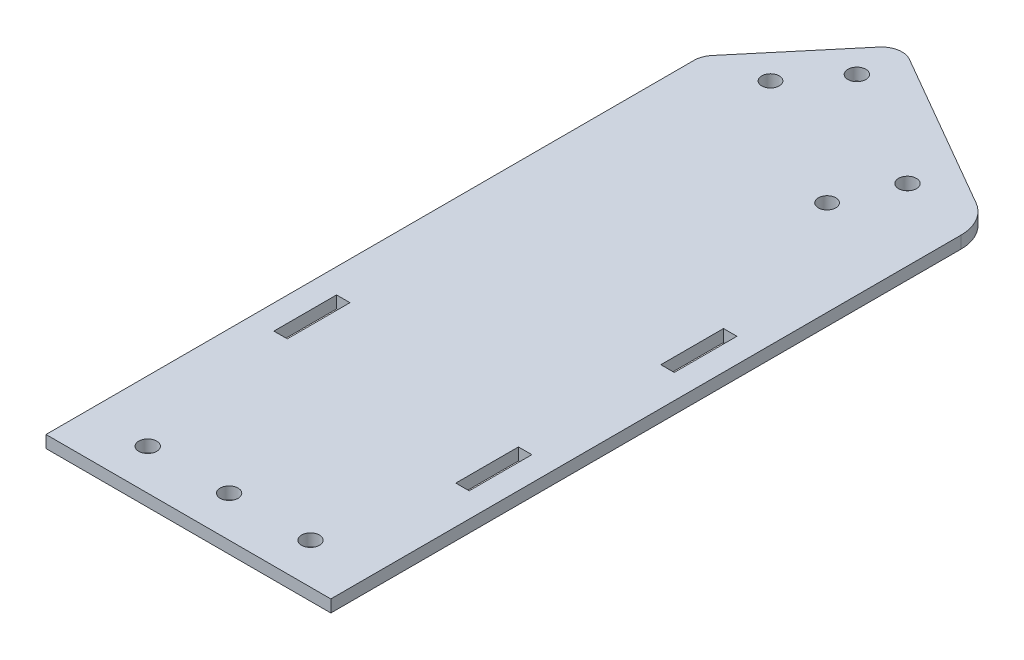
ISO-10303-21;
HEADER;
FILE_DESCRIPTION(('STEP AP214'),'2;1');
FILE_NAME('part.step','',(''),(''),'','','');
FILE_SCHEMA(('AUTOMOTIVE_DESIGN { 1 0 10303 214 1 1 1 1 }'));
ENDSEC;
DATA;
#1=APPLICATION_CONTEXT('core data for automotive mechanical design processes');
#2=APPLICATION_PROTOCOL_DEFINITION('international standard','automotive_design',2000,#1);
#3=PRODUCT_CONTEXT('',#1,'mechanical');
#4=PRODUCT('Part','Part','',(#3));
#5=PRODUCT_RELATED_PRODUCT_CATEGORY('part','',(#4));
#6=PRODUCT_DEFINITION_FORMATION('','',#4);
#7=PRODUCT_DEFINITION_CONTEXT('part definition',#1,'design');
#8=PRODUCT_DEFINITION('design','',#6,#7);
#9=PRODUCT_DEFINITION_SHAPE('','',#8);
#10=(LENGTH_UNIT() NAMED_UNIT(*) SI_UNIT(.MILLI.,.METRE.));
#11=(NAMED_UNIT(*) PLANE_ANGLE_UNIT() SI_UNIT($,.RADIAN.));
#12=(NAMED_UNIT(*) SI_UNIT($,.STERADIAN.) SOLID_ANGLE_UNIT());
#13=UNCERTAINTY_MEASURE_WITH_UNIT(LENGTH_MEASURE(1.E-05),#10,'distance_accuracy_value','');
#14=(GEOMETRIC_REPRESENTATION_CONTEXT(3) GLOBAL_UNCERTAINTY_ASSIGNED_CONTEXT((#13)) GLOBAL_UNIT_ASSIGNED_CONTEXT((#10,
#11,#12)) REPRESENTATION_CONTEXT('',''));
#15=CARTESIAN_POINT('',(0.,0.,0.));
#16=DIRECTION('',(0.,0.,1.));
#17=DIRECTION('',(1.,0.,0.));
#18=AXIS2_PLACEMENT_3D('',#15,#16,#17);
#19=CARTESIAN_POINT('',(35.,1.5,0.));
#20=DIRECTION('',(1.,0.,0.));
#21=DIRECTION('',(0.,0.,-1.));
#22=AXIS2_PLACEMENT_3D('',#19,#20,#21);
#23=PLANE('',#22);
#24=DIRECTION('',(0.,0.,1.));
#25=VECTOR('',#24,1.);
#26=CARTESIAN_POINT('',(35.,-1.5,0.));
#27=LINE('',#26,#25);
#28=CARTESIAN_POINT('',(35.,-1.5,-74.5664973081037));
#29=VERTEX_POINT('',#28);
#30=CARTESIAN_POINT('',(35.,-1.5,80.34));
#31=VERTEX_POINT('',#30);
#32=EDGE_CURVE('E317',#29,#31,#27,.T.);
#33=ORIENTED_EDGE('',*,*,#32,.F.);
#34=DIRECTION('',(0.,-1.,0.));
#35=VECTOR('',#34,1.);
#36=CARTESIAN_POINT('',(35.,1.5,-74.5664973081037));
#37=LINE('',#36,#35);
#38=CARTESIAN_POINT('',(35.,1.5,-74.5664973081037));
#39=VERTEX_POINT('',#38);
#40=EDGE_CURVE('E348',#29,#39,#37,.F.);
#41=ORIENTED_EDGE('',*,*,#40,.T.);
#42=DIRECTION('',(0.,0.,1.));
#43=VECTOR('',#42,1.);
#44=CARTESIAN_POINT('',(35.,1.5,0.));
#45=LINE('',#44,#43);
#46=CARTESIAN_POINT('',(35.,1.5,80.34));
#47=VERTEX_POINT('',#46);
#48=EDGE_CURVE('E318',#39,#47,#45,.T.);
#49=ORIENTED_EDGE('',*,*,#48,.T.);
#50=DIRECTION('',(0.,-1.,0.));
#51=VECTOR('',#50,1.);
#52=CARTESIAN_POINT('',(35.,1.5,80.34));
#53=LINE('',#52,#51);
#54=EDGE_CURVE('E329',#47,#31,#53,.T.);
#55=ORIENTED_EDGE('',*,*,#54,.T.);
#56=EDGE_LOOP('',(#33,#41,#49,#55));
#57=FACE_BOUND('',#56,.T.);
#58=ADVANCED_FACE('F44',(#57),#23,.T.);
#59=CARTESIAN_POINT('',(43.5382404700205,1.5,-75.410444566228));
#60=DIRECTION('',(-0.499999999999995,0.,0.866025403784441));
#61=DIRECTION('',(0.866025403784442,0.,0.499999999999995));
#62=AXIS2_PLACEMENT_3D('',#59,#60,#61);
#63=PLANE('',#62);
#64=DIRECTION('',(-0.866025403784442,0.,-0.499999999999995));
#65=VECTOR('',#64,1.);
#66=CARTESIAN_POINT('',(43.5382404700205,-1.5,-75.410444566228));
#67=LINE('',#66,#65);
#68=CARTESIAN_POINT('',(29.9999999999999,-1.5,-83.2267513459481));
#69=VERTEX_POINT('',#68);
#70=CARTESIAN_POINT('',(-8.75627451852881,-1.5,-105.602696872007));
#71=VERTEX_POINT('',#70);
#72=EDGE_CURVE('E331',#69,#71,#67,.T.);
#73=ORIENTED_EDGE('',*,*,#72,.T.);
#74=DIRECTION('',(0.,-1.,0.));
#75=VECTOR('',#74,1.);
#76=CARTESIAN_POINT('',(-8.75627451852879,1.5,-105.602696872007));
#77=LINE('',#76,#75);
#78=CARTESIAN_POINT('',(-8.75627451852881,1.5,-105.602696872007));
#79=VERTEX_POINT('',#78);
#80=EDGE_CURVE('E11',#71,#79,#77,.F.);
#81=ORIENTED_EDGE('',*,*,#80,.T.);
#82=DIRECTION('',(-0.866025403784442,0.,-0.499999999999995));
#83=VECTOR('',#82,1.);
#84=CARTESIAN_POINT('',(43.5382404700205,1.5,-75.410444566228));
#85=LINE('',#84,#83);
#86=CARTESIAN_POINT('',(29.9999999999999,1.5,-83.2267513459481));
#87=VERTEX_POINT('',#86);
#88=EDGE_CURVE('E320',#87,#79,#85,.T.);
#89=ORIENTED_EDGE('',*,*,#88,.F.);
#90=DIRECTION('',(0.,-1.,0.));
#91=VECTOR('',#90,1.);
#92=CARTESIAN_POINT('',(29.9999999999999,-1.5,-83.2267513459481));
#93=LINE('',#92,#91);
#94=EDGE_CURVE('E343',#87,#69,#93,.T.);
#95=ORIENTED_EDGE('',*,*,#94,.T.);
#96=EDGE_LOOP('',(#73,#81,#89,#95));
#97=FACE_BOUND('',#96,.T.);
#98=ADVANCED_FACE('F442',(#97),#63,.F.);
#99=CARTESIAN_POINT('',(-35.,1.5,0.));
#100=DIRECTION('',(1.,0.,0.));
#101=DIRECTION('',(0.,0.,-1.));
#102=AXIS2_PLACEMENT_3D('',#99,#100,#101);
#103=PLANE('',#102);
#104=DIRECTION('',(0.,0.,1.));
#105=VECTOR('',#104,1.);
#106=CARTESIAN_POINT('',(-35.,1.5,0.));
#107=LINE('',#106,#105);
#108=CARTESIAN_POINT('',(-35.,1.5,-78.9346676719422));
#109=VERTEX_POINT('',#108);
#110=CARTESIAN_POINT('',(-35.,1.5,80.34));
#111=VERTEX_POINT('',#110);
#112=EDGE_CURVE('E324',#109,#111,#107,.T.);
#113=ORIENTED_EDGE('',*,*,#112,.F.);
#114=DIRECTION('',(0.,1.,0.));
#115=VECTOR('',#114,1.);
#116=CARTESIAN_POINT('',(-35.,-1.5,-78.9346676719422));
#117=LINE('',#116,#115);
#118=CARTESIAN_POINT('',(-35.,-1.5,-78.9346676719422));
#119=VERTEX_POINT('',#118);
#120=EDGE_CURVE('E358',#109,#119,#117,.F.);
#121=ORIENTED_EDGE('',*,*,#120,.T.);
#122=DIRECTION('',(0.,0.,1.));
#123=VECTOR('',#122,1.);
#124=CARTESIAN_POINT('',(-35.,-1.5,0.));
#125=LINE('',#124,#123);
#126=CARTESIAN_POINT('',(-35.,-1.5,80.34));
#127=VERTEX_POINT('',#126);
#128=EDGE_CURVE('E334',#119,#127,#125,.T.);
#129=ORIENTED_EDGE('',*,*,#128,.T.);
#130=DIRECTION('',(0.,-1.,0.));
#131=VECTOR('',#130,1.);
#132=CARTESIAN_POINT('',(-35.,1.5,80.34));
#133=LINE('',#132,#131);
#134=EDGE_CURVE('E340',#111,#127,#133,.T.);
#135=ORIENTED_EDGE('',*,*,#134,.F.);
#136=EDGE_LOOP('',(#113,#121,#129,#135));
#137=FACE_BOUND('',#136,.T.);
#138=ADVANCED_FACE('F423',(#137),#103,.F.);
#139=CARTESIAN_POINT('',(0.,1.5,80.34));
#140=DIRECTION('',(0.,0.,-1.));
#141=DIRECTION('',(-1.,0.,0.));
#142=AXIS2_PLACEMENT_3D('',#139,#140,#141);
#143=PLANE('',#142);
#144=DIRECTION('',(1.,0.,0.));
#145=VECTOR('',#144,1.);
#146=CARTESIAN_POINT('',(0.,-1.5,80.34));
#147=LINE('',#146,#145);
#148=EDGE_CURVE('E321',#127,#31,#147,.T.);
#149=ORIENTED_EDGE('',*,*,#148,.T.);
#150=ORIENTED_EDGE('',*,*,#54,.F.);
#151=DIRECTION('',(1.,0.,0.));
#152=VECTOR('',#151,1.);
#153=CARTESIAN_POINT('',(0.,1.5,80.34));
#154=LINE('',#153,#152);
#155=EDGE_CURVE('E326',#111,#47,#154,.T.);
#156=ORIENTED_EDGE('',*,*,#155,.F.);
#157=ORIENTED_EDGE('',*,*,#134,.T.);
#158=EDGE_LOOP('',(#149,#150,#156,#157));
#159=FACE_BOUND('',#158,.T.);
#160=ADVANCED_FACE('F389',(#159),#143,.F.);
#161=CARTESIAN_POINT('',(0.,1.5,0.));
#162=DIRECTION('',(0.,1.,0.));
#163=DIRECTION('',(0.,0.,1.));
#164=AXIS2_PLACEMENT_3D('',#161,#162,#163);
#165=PLANE('',#164);
#166=CARTESIAN_POINT('',(-21.2320508075689,1.5,-83.9380762113534));
#167=DIRECTION('',(0.,1.,0.));
#168=DIRECTION('',(0.,0.,1.));
#169=AXIS2_PLACEMENT_3D('',#166,#167,#168);
#170=CIRCLE('',#169,2.15);
#171=CARTESIAN_POINT('',(-21.2320508075689,1.5,-81.7880762113534));
#172=VERTEX_POINT('',#171);
#173=EDGE_CURVE('E373',#172,#172,#170,.T.);
#174=ORIENTED_EDGE('',*,*,#173,.F.);
#175=EDGE_LOOP('',(#174));
#176=FACE_BOUND('',#175,.T.);
#177=CARTESIAN_POINT('',(11.6769145362398,1.5,-64.9380762113534));
#178=DIRECTION('',(0.,1.,0.));
#179=DIRECTION('',(0.,0.,1.));
#180=AXIS2_PLACEMENT_3D('',#177,#178,#179);
#181=CIRCLE('',#180,2.14999999999999);
#182=CARTESIAN_POINT('',(11.6769145362398,1.5,-62.7880762113534));
#183=VERTEX_POINT('',#182);
#184=EDGE_CURVE('E211',#183,#183,#181,.T.);
#185=ORIENTED_EDGE('',*,*,#184,.F.);
#186=EDGE_LOOP('',(#185));
#187=FACE_BOUND('',#186,.T.);
#188=DIRECTION('',(0.,0.,1.));
#189=VECTOR('',#188,1.);
#190=CARTESIAN_POINT('',(-29.,1.5,0.));
#191=LINE('',#190,#189);
#192=CARTESIAN_POINT('',(-29.,1.5,14.94));
#193=VERTEX_POINT('',#192);
#194=CARTESIAN_POINT('',(-29.,1.5,30.34));
#195=VERTEX_POINT('',#194);
#196=EDGE_CURVE('E188',#193,#195,#191,.T.);
#197=ORIENTED_EDGE('',*,*,#196,.F.);
#198=DIRECTION('',(-1.,0.,0.));
#199=VECTOR('',#198,1.);
#200=CARTESIAN_POINT('',(0.,1.5,14.94));
#201=LINE('',#200,#199);
#202=CARTESIAN_POINT('',(-25.7,1.5,14.94));
#203=VERTEX_POINT('',#202);
#204=EDGE_CURVE('E284',#203,#193,#201,.T.);
#205=ORIENTED_EDGE('',*,*,#204,.F.);
#206=DIRECTION('',(0.,0.,-1.));
#207=VECTOR('',#206,1.);
#208=CARTESIAN_POINT('',(-25.7,1.5,0.));
#209=LINE('',#208,#207);
#210=CARTESIAN_POINT('',(-25.7,1.5,30.34));
#211=VERTEX_POINT('',#210);
#212=EDGE_CURVE('E282',#211,#203,#209,.T.);
#213=ORIENTED_EDGE('',*,*,#212,.F.);
#214=DIRECTION('',(1.,0.,0.));
#215=VECTOR('',#214,1.);
#216=CARTESIAN_POINT('',(0.,1.5,30.34));
#217=LINE('',#216,#215);
#218=EDGE_CURVE('E280',#195,#211,#217,.T.);
#219=ORIENTED_EDGE('',*,*,#218,.F.);
#220=EDGE_LOOP('',(#197,#205,#213,#219));
#221=FACE_BOUND('',#220,.T.);
#222=DIRECTION('',(0.,0.,1.));
#223=VECTOR('',#222,1.);
#224=CARTESIAN_POINT('',(25.7,1.5,0.));
#225=LINE('',#224,#223);
#226=CARTESIAN_POINT('',(25.7,1.5,24.94));
#227=VERTEX_POINT('',#226);
#228=CARTESIAN_POINT('',(25.7,1.5,40.34));
#229=VERTEX_POINT('',#228);
#230=EDGE_CURVE('E278',#227,#229,#225,.T.);
#231=ORIENTED_EDGE('',*,*,#230,.F.);
#232=DIRECTION('',(-1.,0.,0.));
#233=VECTOR('',#232,1.);
#234=CARTESIAN_POINT('',(0.,1.5,24.94));
#235=LINE('',#234,#233);
#236=CARTESIAN_POINT('',(29.,1.5,24.94));
#237=VERTEX_POINT('',#236);
#238=EDGE_CURVE('E276',#237,#227,#235,.T.);
#239=ORIENTED_EDGE('',*,*,#238,.F.);
#240=DIRECTION('',(0.,0.,-1.));
#241=VECTOR('',#240,1.);
#242=CARTESIAN_POINT('',(29.,1.5,0.));
#243=LINE('',#242,#241);
#244=CARTESIAN_POINT('',(29.,1.5,40.34));
#245=VERTEX_POINT('',#244);
#246=EDGE_CURVE('E274',#245,#237,#243,.T.);
#247=ORIENTED_EDGE('',*,*,#246,.F.);
#248=DIRECTION('',(1.,0.,0.));
#249=VECTOR('',#248,1.);
#250=CARTESIAN_POINT('',(0.,1.5,40.34));
#251=LINE('',#250,#249);
#252=EDGE_CURVE('E272',#229,#245,#251,.T.);
#253=ORIENTED_EDGE('',*,*,#252,.F.);
#254=EDGE_LOOP('',(#231,#239,#247,#253));
#255=FACE_BOUND('',#254,.T.);
#256=DIRECTION('',(-1.,0.,0.));
#257=VECTOR('',#256,1.);
#258=CARTESIAN_POINT('',(0.,1.5,-25.46));
#259=LINE('',#258,#257);
#260=CARTESIAN_POINT('',(29.,1.5,-25.46));
#261=VERTEX_POINT('',#260);
#262=CARTESIAN_POINT('',(25.7,1.5,-25.46));
#263=VERTEX_POINT('',#262);
#264=EDGE_CURVE('E269',#261,#263,#259,.T.);
#265=ORIENTED_EDGE('',*,*,#264,.F.);
#266=DIRECTION('',(0.,0.,-1.));
#267=VECTOR('',#266,1.);
#268=CARTESIAN_POINT('',(29.,1.5,0.));
#269=LINE('',#268,#267);
#270=CARTESIAN_POINT('',(29.,1.5,-10.06));
#271=VERTEX_POINT('',#270);
#272=EDGE_CURVE('E267',#271,#261,#269,.T.);
#273=ORIENTED_EDGE('',*,*,#272,.F.);
#274=DIRECTION('',(1.,0.,0.));
#275=VECTOR('',#274,1.);
#276=CARTESIAN_POINT('',(0.,1.5,-10.06));
#277=LINE('',#276,#275);
#278=CARTESIAN_POINT('',(25.7,1.5,-10.06));
#279=VERTEX_POINT('',#278);
#280=EDGE_CURVE('E265',#279,#271,#277,.T.);
#281=ORIENTED_EDGE('',*,*,#280,.F.);
#282=DIRECTION('',(0.,0.,1.));
#283=VECTOR('',#282,1.);
#284=CARTESIAN_POINT('',(25.7,1.5,0.));
#285=LINE('',#284,#283);
#286=EDGE_CURVE('E218',#263,#279,#285,.T.);
#287=ORIENTED_EDGE('',*,*,#286,.F.);
#288=EDGE_LOOP('',(#265,#273,#281,#287));
#289=FACE_BOUND('',#288,.T.);
#290=CARTESIAN_POINT('',(20.,1.5,70.34));
#291=DIRECTION('',(0.,1.,0.));
#292=DIRECTION('',(0.,0.,1.));
#293=AXIS2_PLACEMENT_3D('',#290,#291,#292);
#294=CIRCLE('',#293,2.2);
#295=CARTESIAN_POINT('',(20.,1.5,72.54));
#296=VERTEX_POINT('',#295);
#297=EDGE_CURVE('E302',#296,#296,#294,.T.);
#298=ORIENTED_EDGE('',*,*,#297,.F.);
#299=EDGE_LOOP('',(#298));
#300=FACE_BOUND('',#299,.T.);
#301=CARTESIAN_POINT('',(-20.,1.5,70.34));
#302=DIRECTION('',(0.,1.,0.));
#303=DIRECTION('',(0.,0.,1.));
#304=AXIS2_PLACEMENT_3D('',#301,#302,#303);
#305=CIRCLE('',#304,2.2);
#306=CARTESIAN_POINT('',(-20.,1.5,72.54));
#307=VERTEX_POINT('',#306);
#308=EDGE_CURVE('E299',#307,#307,#305,.T.);
#309=ORIENTED_EDGE('',*,*,#308,.F.);
#310=EDGE_LOOP('',(#309));
#311=FACE_BOUND('',#310,.T.);
#312=CARTESIAN_POINT('',(0.,1.5,70.34));
#313=DIRECTION('',(0.,1.,0.));
#314=DIRECTION('',(0.,0.,1.));
#315=AXIS2_PLACEMENT_3D('',#312,#313,#314);
#316=CIRCLE('',#315,2.2);
#317=CARTESIAN_POINT('',(0.,1.5,72.54));
#318=VERTEX_POINT('',#317);
#319=EDGE_CURVE('E296',#318,#318,#316,.T.);
#320=ORIENTED_EDGE('',*,*,#319,.F.);
#321=EDGE_LOOP('',(#320));
#322=FACE_BOUND('',#321,.T.);
#323=CARTESIAN_POINT('',(-12.,1.5,-95.9284572681199));
#324=DIRECTION('',(0.,1.,0.));
#325=DIRECTION('',(0.,0.,1.));
#326=AXIS2_PLACEMENT_3D('',#323,#324,#325);
#327=CIRCLE('',#326,2.19999999999999);
#328=CARTESIAN_POINT('',(-12.,1.5,-93.7284572681199));
#329=VERTEX_POINT('',#328);
#330=EDGE_CURVE('E314',#329,#329,#327,.T.);
#331=ORIENTED_EDGE('',*,*,#330,.F.);
#332=EDGE_LOOP('',(#331));
#333=FACE_BOUND('',#332,.T.);
#334=CARTESIAN_POINT('',(17.4448637286709,1.5,-78.92845726812));
#335=DIRECTION('',(0.,1.,0.));
#336=DIRECTION('',(0.,0.,1.));
#337=AXIS2_PLACEMENT_3D('',#334,#335,#336);
#338=CIRCLE('',#337,2.20000000000001);
#339=CARTESIAN_POINT('',(17.4448637286709,1.5,-76.7284572681199));
#340=VERTEX_POINT('',#339);
#341=EDGE_CURVE('E309',#340,#340,#338,.T.);
#342=ORIENTED_EDGE('',*,*,#341,.F.);
#343=EDGE_LOOP('',(#342));
#344=FACE_BOUND('',#343,.T.);
#345=DIRECTION('',(0.642787609686539,0.,-0.766044443118979));
#346=VECTOR('',#345,1.);
#347=CARTESIAN_POINT('',(-60.3026812329843,1.5,-50.5999575815981));
#348=LINE('',#347,#346);
#349=CARTESIAN_POINT('',(-15.0864967341237,1.5,-104.486507901518));
#350=VERTEX_POINT('',#349);
#351=CARTESIAN_POINT('',(-33.8302222155949,1.5,-82.1486057203749));
#352=VERTEX_POINT('',#351);
#353=EDGE_CURVE('E355',#350,#352,#348,.F.);
#354=ORIENTED_EDGE('',*,*,#353,.T.);
#355=CARTESIAN_POINT('',(-30.,1.5,-78.9346676719422));
#356=DIRECTION('',(0.,1.,0.));
#357=DIRECTION('',(0.,0.,1.));
#358=AXIS2_PLACEMENT_3D('',#355,#356,#357);
#359=CIRCLE('',#358,5.);
#360=EDGE_CURVE('E53',#352,#109,#359,.T.);
#361=ORIENTED_EDGE('',*,*,#360,.T.);
#362=ORIENTED_EDGE('',*,*,#112,.T.);
#363=ORIENTED_EDGE('',*,*,#155,.T.);
#364=ORIENTED_EDGE('',*,*,#48,.F.);
#365=CARTESIAN_POINT('',(25.,1.5,-74.5664973081037));
#366=DIRECTION('',(0.,1.,0.));
#367=DIRECTION('',(0.,0.,1.));
#368=AXIS2_PLACEMENT_3D('',#365,#366,#367);
#369=CIRCLE('',#368,10.);
#370=EDGE_CURVE('E350',#39,#87,#369,.T.);
#371=ORIENTED_EDGE('',*,*,#370,.T.);
#372=ORIENTED_EDGE('',*,*,#88,.T.);
#373=CARTESIAN_POINT('',(-11.2562745185288,1.5,-101.272569853085));
#374=DIRECTION('',(0.,1.,0.));
#375=DIRECTION('',(0.,0.,1.));
#376=AXIS2_PLACEMENT_3D('',#373,#374,#375);
#377=CIRCLE('',#376,5.);
#378=EDGE_CURVE('E369',#79,#350,#377,.T.);
#379=ORIENTED_EDGE('',*,*,#378,.T.);
#380=EDGE_LOOP('',(#354,#361,#362,#363,#364,#371,#372,#379));
#381=FACE_BOUND('',#380,.T.);
#382=ADVANCED_FACE('F386',(#176,#187,#221,#255,#289,#300,#311,#322,#333,#344,#381),#165,.T.);
#383=CARTESIAN_POINT('',(0.,-1.5,0.));
#384=DIRECTION('',(0.,1.,0.));
#385=DIRECTION('',(0.,0.,1.));
#386=AXIS2_PLACEMENT_3D('',#383,#384,#385);
#387=PLANE('',#386);
#388=CARTESIAN_POINT('',(-21.2320508075689,-1.5,-83.9380762113534));
#389=DIRECTION('',(0.,1.,0.));
#390=DIRECTION('',(0.,0.,1.));
#391=AXIS2_PLACEMENT_3D('',#388,#389,#390);
#392=CIRCLE('',#391,2.15);
#393=CARTESIAN_POINT('',(-21.2320508075689,-1.5,-81.7880762113534));
#394=VERTEX_POINT('',#393);
#395=EDGE_CURVE('E48',#394,#394,#392,.T.);
#396=ORIENTED_EDGE('',*,*,#395,.T.);
#397=EDGE_LOOP('',(#396));
#398=FACE_BOUND('',#397,.T.);
#399=CARTESIAN_POINT('',(11.6769145362398,-1.5,-64.9380762113534));
#400=DIRECTION('',(0.,1.,0.));
#401=DIRECTION('',(0.,0.,1.));
#402=AXIS2_PLACEMENT_3D('',#399,#400,#401);
#403=CIRCLE('',#402,2.14999999999999);
#404=CARTESIAN_POINT('',(11.6769145362398,-1.5,-62.7880762113534));
#405=VERTEX_POINT('',#404);
#406=EDGE_CURVE('E371',#405,#405,#403,.T.);
#407=ORIENTED_EDGE('',*,*,#406,.T.);
#408=EDGE_LOOP('',(#407));
#409=FACE_BOUND('',#408,.T.);
#410=DIRECTION('',(-1.,0.,0.));
#411=VECTOR('',#410,1.);
#412=CARTESIAN_POINT('',(-29.,-1.5,14.94));
#413=LINE('',#412,#411);
#414=CARTESIAN_POINT('',(-25.7,-1.5,14.94));
#415=VERTEX_POINT('',#414);
#416=CARTESIAN_POINT('',(-29.,-1.5,14.94));
#417=VERTEX_POINT('',#416);
#418=EDGE_CURVE('E191',#415,#417,#413,.T.);
#419=ORIENTED_EDGE('',*,*,#418,.T.);
#420=DIRECTION('',(0.,0.,1.));
#421=VECTOR('',#420,1.);
#422=CARTESIAN_POINT('',(-29.,-1.5,14.94));
#423=LINE('',#422,#421);
#424=CARTESIAN_POINT('',(-29.,-1.5,30.34));
#425=VERTEX_POINT('',#424);
#426=EDGE_CURVE('E185',#417,#425,#423,.T.);
#427=ORIENTED_EDGE('',*,*,#426,.T.);
#428=DIRECTION('',(1.,0.,0.));
#429=VECTOR('',#428,1.);
#430=CARTESIAN_POINT('',(-29.,-1.5,30.34));
#431=LINE('',#430,#429);
#432=CARTESIAN_POINT('',(-25.7,-1.5,30.34));
#433=VERTEX_POINT('',#432);
#434=EDGE_CURVE('E195',#425,#433,#431,.T.);
#435=ORIENTED_EDGE('',*,*,#434,.T.);
#436=DIRECTION('',(0.,0.,-1.));
#437=VECTOR('',#436,1.);
#438=CARTESIAN_POINT('',(-25.7,-1.5,14.94));
#439=LINE('',#438,#437);
#440=EDGE_CURVE('E200',#433,#415,#439,.T.);
#441=ORIENTED_EDGE('',*,*,#440,.T.);
#442=EDGE_LOOP('',(#419,#427,#435,#441));
#443=FACE_BOUND('',#442,.T.);
#444=DIRECTION('',(-1.,0.,0.));
#445=VECTOR('',#444,1.);
#446=CARTESIAN_POINT('',(25.7,-1.5,24.94));
#447=LINE('',#446,#445);
#448=CARTESIAN_POINT('',(29.,-1.5,24.94));
#449=VERTEX_POINT('',#448);
#450=CARTESIAN_POINT('',(25.7,-1.5,24.94));
#451=VERTEX_POINT('',#450);
#452=EDGE_CURVE('E224',#449,#451,#447,.T.);
#453=ORIENTED_EDGE('',*,*,#452,.T.);
#454=DIRECTION('',(0.,0.,1.));
#455=VECTOR('',#454,1.);
#456=CARTESIAN_POINT('',(25.7,-1.5,24.94));
#457=LINE('',#456,#455);
#458=CARTESIAN_POINT('',(25.7,-1.5,40.34));
#459=VERTEX_POINT('',#458);
#460=EDGE_CURVE('E205',#451,#459,#457,.T.);
#461=ORIENTED_EDGE('',*,*,#460,.T.);
#462=DIRECTION('',(1.,0.,0.));
#463=VECTOR('',#462,1.);
#464=CARTESIAN_POINT('',(25.7,-1.5,40.34));
#465=LINE('',#464,#463);
#466=CARTESIAN_POINT('',(29.,-1.5,40.34));
#467=VERTEX_POINT('',#466);
#468=EDGE_CURVE('E208',#459,#467,#465,.T.);
#469=ORIENTED_EDGE('',*,*,#468,.T.);
#470=DIRECTION('',(0.,0.,-1.));
#471=VECTOR('',#470,1.);
#472=CARTESIAN_POINT('',(29.,-1.5,24.94));
#473=LINE('',#472,#471);
#474=EDGE_CURVE('E237',#467,#449,#473,.T.);
#475=ORIENTED_EDGE('',*,*,#474,.T.);
#476=EDGE_LOOP('',(#453,#461,#469,#475));
#477=FACE_BOUND('',#476,.T.);
#478=DIRECTION('',(0.,0.,-1.));
#479=VECTOR('',#478,1.);
#480=CARTESIAN_POINT('',(29.,-1.5,-25.46));
#481=LINE('',#480,#479);
#482=CARTESIAN_POINT('',(29.,-1.5,-10.06));
#483=VERTEX_POINT('',#482);
#484=CARTESIAN_POINT('',(29.,-1.5,-25.46));
#485=VERTEX_POINT('',#484);
#486=EDGE_CURVE('E244',#483,#485,#481,.T.);
#487=ORIENTED_EDGE('',*,*,#486,.T.);
#488=DIRECTION('',(-1.,0.,0.));
#489=VECTOR('',#488,1.);
#490=CARTESIAN_POINT('',(25.7,-1.5,-25.46));
#491=LINE('',#490,#489);
#492=CARTESIAN_POINT('',(25.7,-1.5,-25.46));
#493=VERTEX_POINT('',#492);
#494=EDGE_CURVE('E234',#485,#493,#491,.T.);
#495=ORIENTED_EDGE('',*,*,#494,.T.);
#496=DIRECTION('',(0.,0.,1.));
#497=VECTOR('',#496,1.);
#498=CARTESIAN_POINT('',(25.7,-1.5,-25.46));
#499=LINE('',#498,#497);
#500=CARTESIAN_POINT('',(25.7,-1.5,-10.06));
#501=VERTEX_POINT('',#500);
#502=EDGE_CURVE('E259',#493,#501,#499,.T.);
#503=ORIENTED_EDGE('',*,*,#502,.T.);
#504=DIRECTION('',(1.,0.,0.));
#505=VECTOR('',#504,1.);
#506=CARTESIAN_POINT('',(25.7,-1.5,-10.06));
#507=LINE('',#506,#505);
#508=EDGE_CURVE('E256',#501,#483,#507,.T.);
#509=ORIENTED_EDGE('',*,*,#508,.T.);
#510=EDGE_LOOP('',(#487,#495,#503,#509));
#511=FACE_BOUND('',#510,.T.);
#512=CARTESIAN_POINT('',(20.,-1.5,70.34));
#513=DIRECTION('',(0.,1.,0.));
#514=DIRECTION('',(0.,0.,1.));
#515=AXIS2_PLACEMENT_3D('',#512,#513,#514);
#516=CIRCLE('',#515,2.2);
#517=CARTESIAN_POINT('',(20.,-1.5,72.54));
#518=VERTEX_POINT('',#517);
#519=EDGE_CURVE('E287',#518,#518,#516,.T.);
#520=ORIENTED_EDGE('',*,*,#519,.T.);
#521=EDGE_LOOP('',(#520));
#522=FACE_BOUND('',#521,.T.);
#523=CARTESIAN_POINT('',(-20.,-1.5,70.34));
#524=DIRECTION('',(0.,1.,0.));
#525=DIRECTION('',(0.,0.,1.));
#526=AXIS2_PLACEMENT_3D('',#523,#524,#525);
#527=CIRCLE('',#526,2.2);
#528=CARTESIAN_POINT('',(-20.,-1.5,72.54));
#529=VERTEX_POINT('',#528);
#530=EDGE_CURVE('E288',#529,#529,#527,.T.);
#531=ORIENTED_EDGE('',*,*,#530,.T.);
#532=EDGE_LOOP('',(#531));
#533=FACE_BOUND('',#532,.T.);
#534=CARTESIAN_POINT('',(0.,-1.5,70.34));
#535=DIRECTION('',(0.,1.,0.));
#536=DIRECTION('',(0.,0.,1.));
#537=AXIS2_PLACEMENT_3D('',#534,#535,#536);
#538=CIRCLE('',#537,2.2);
#539=CARTESIAN_POINT('',(0.,-1.5,72.54));
#540=VERTEX_POINT('',#539);
#541=EDGE_CURVE('E291',#540,#540,#538,.T.);
#542=ORIENTED_EDGE('',*,*,#541,.T.);
#543=EDGE_LOOP('',(#542));
#544=FACE_BOUND('',#543,.T.);
#545=CARTESIAN_POINT('',(-12.,-1.5,-95.9284572681199));
#546=DIRECTION('',(0.,1.,0.));
#547=DIRECTION('',(0.,0.,1.));
#548=AXIS2_PLACEMENT_3D('',#545,#546,#547);
#549=CIRCLE('',#548,2.19999999999999);
#550=CARTESIAN_POINT('',(-12.,-1.5,-93.7284572681199));
#551=VERTEX_POINT('',#550);
#552=EDGE_CURVE('E306',#551,#551,#549,.T.);
#553=ORIENTED_EDGE('',*,*,#552,.T.);
#554=EDGE_LOOP('',(#553));
#555=FACE_BOUND('',#554,.T.);
#556=CARTESIAN_POINT('',(17.4448637286709,-1.5,-78.92845726812));
#557=DIRECTION('',(0.,1.,0.));
#558=DIRECTION('',(0.,0.,1.));
#559=AXIS2_PLACEMENT_3D('',#556,#557,#558);
#560=CIRCLE('',#559,2.20000000000001);
#561=CARTESIAN_POINT('',(17.4448637286709,-1.5,-76.7284572681199));
#562=VERTEX_POINT('',#561);
#563=EDGE_CURVE('E305',#562,#562,#560,.T.);
#564=ORIENTED_EDGE('',*,*,#563,.T.);
#565=EDGE_LOOP('',(#564));
#566=FACE_BOUND('',#565,.T.);
#567=ORIENTED_EDGE('',*,*,#128,.F.);
#568=CARTESIAN_POINT('',(-30.,-1.5,-78.9346676719422));
#569=DIRECTION('',(0.,1.,0.));
#570=DIRECTION('',(0.,0.,1.));
#571=AXIS2_PLACEMENT_3D('',#568,#569,#570);
#572=CIRCLE('',#571,5.);
#573=CARTESIAN_POINT('',(-33.8302222155949,-1.5,-82.1486057203749));
#574=VERTEX_POINT('',#573);
#575=EDGE_CURVE('E363',#119,#574,#572,.F.);
#576=ORIENTED_EDGE('',*,*,#575,.T.);
#577=DIRECTION('',(-0.642787609686539,0.,0.766044443118979));
#578=VECTOR('',#577,1.);
#579=CARTESIAN_POINT('',(-35.,-1.5,-80.7545188432732));
#580=LINE('',#579,#578);
#581=CARTESIAN_POINT('',(-15.0864967341237,-1.5,-104.486507901518));
#582=VERTEX_POINT('',#581);
#583=EDGE_CURVE('E352',#574,#582,#580,.F.);
#584=ORIENTED_EDGE('',*,*,#583,.T.);
#585=CARTESIAN_POINT('',(-11.2562745185288,-1.5,-101.272569853085));
#586=DIRECTION('',(0.,1.,0.));
#587=DIRECTION('',(0.,0.,1.));
#588=AXIS2_PLACEMENT_3D('',#585,#586,#587);
#589=CIRCLE('',#588,5.);
#590=EDGE_CURVE('E361',#582,#71,#589,.F.);
#591=ORIENTED_EDGE('',*,*,#590,.T.);
#592=ORIENTED_EDGE('',*,*,#72,.F.);
#593=CARTESIAN_POINT('',(25.,-1.5,-74.5664973081037));
#594=DIRECTION('',(0.,1.,0.));
#595=DIRECTION('',(0.,0.,1.));
#596=AXIS2_PLACEMENT_3D('',#593,#594,#595);
#597=CIRCLE('',#596,10.);
#598=EDGE_CURVE('E346',#69,#29,#597,.F.);
#599=ORIENTED_EDGE('',*,*,#598,.T.);
#600=ORIENTED_EDGE('',*,*,#32,.T.);
#601=ORIENTED_EDGE('',*,*,#148,.F.);
#602=EDGE_LOOP('',(#567,#576,#584,#591,#592,#599,#600,#601));
#603=FACE_BOUND('',#602,.T.);
#604=ADVANCED_FACE('F202',(#398,#409,#443,#477,#511,#522,#533,#544,#555,#566,#603),#387,.F.);
#605=CARTESIAN_POINT('',(17.4448637286709,-1.5,-78.92845726812));
#606=DIRECTION('',(0.,1.,0.));
#607=DIRECTION('',(0.,0.,1.));
#608=AXIS2_PLACEMENT_3D('',#605,#606,#607);
#609=CYLINDRICAL_SURFACE('',#608,2.20000000000001);
#610=ORIENTED_EDGE('',*,*,#341,.T.);
#611=EDGE_LOOP('',(#610));
#612=FACE_BOUND('',#611,.T.);
#613=ORIENTED_EDGE('',*,*,#563,.F.);
#614=EDGE_LOOP('',(#613));
#615=FACE_BOUND('',#614,.T.);
#616=ADVANCED_FACE('F475',(#612,#615),#609,.F.);
#617=CARTESIAN_POINT('',(-12.,-1.5,-95.9284572681199));
#618=DIRECTION('',(0.,1.,0.));
#619=DIRECTION('',(0.,0.,1.));
#620=AXIS2_PLACEMENT_3D('',#617,#618,#619);
#621=CYLINDRICAL_SURFACE('',#620,2.19999999999999);
#622=ORIENTED_EDGE('',*,*,#330,.T.);
#623=EDGE_LOOP('',(#622));
#624=FACE_BOUND('',#623,.T.);
#625=ORIENTED_EDGE('',*,*,#552,.F.);
#626=EDGE_LOOP('',(#625));
#627=FACE_BOUND('',#626,.T.);
#628=ADVANCED_FACE('F468',(#624,#627),#621,.F.);
#629=CARTESIAN_POINT('',(25.,1.5,-74.5664973081037));
#630=DIRECTION('',(0.,1.,0.));
#631=DIRECTION('',(0.,0.,1.));
#632=AXIS2_PLACEMENT_3D('',#629,#630,#631);
#633=CYLINDRICAL_SURFACE('',#632,10.);
#634=ORIENTED_EDGE('',*,*,#370,.F.);
#635=ORIENTED_EDGE('',*,*,#40,.F.);
#636=ORIENTED_EDGE('',*,*,#598,.F.);
#637=ORIENTED_EDGE('',*,*,#94,.F.);
#638=EDGE_LOOP('',(#634,#635,#636,#637));
#639=FACE_BOUND('',#638,.T.);
#640=ADVANCED_FACE('F439',(#639),#633,.T.);
#641=CARTESIAN_POINT('',(0.,-1.5,70.34));
#642=DIRECTION('',(0.,1.,0.));
#643=DIRECTION('',(0.,0.,1.));
#644=AXIS2_PLACEMENT_3D('',#641,#642,#643);
#645=CYLINDRICAL_SURFACE('',#644,2.2);
#646=ORIENTED_EDGE('',*,*,#319,.T.);
#647=EDGE_LOOP('',(#646));
#648=FACE_BOUND('',#647,.T.);
#649=ORIENTED_EDGE('',*,*,#541,.F.);
#650=EDGE_LOOP('',(#649));
#651=FACE_BOUND('',#650,.T.);
#652=ADVANCED_FACE('F467',(#648,#651),#645,.F.);
#653=CARTESIAN_POINT('',(-20.,-1.5,70.34));
#654=DIRECTION('',(0.,1.,0.));
#655=DIRECTION('',(0.,0.,1.));
#656=AXIS2_PLACEMENT_3D('',#653,#654,#655);
#657=CYLINDRICAL_SURFACE('',#656,2.2);
#658=ORIENTED_EDGE('',*,*,#308,.T.);
#659=EDGE_LOOP('',(#658));
#660=FACE_BOUND('',#659,.T.);
#661=ORIENTED_EDGE('',*,*,#530,.F.);
#662=EDGE_LOOP('',(#661));
#663=FACE_BOUND('',#662,.T.);
#664=ADVANCED_FACE('F454',(#660,#663),#657,.F.);
#665=CARTESIAN_POINT('',(20.,-1.5,70.34));
#666=DIRECTION('',(0.,1.,0.));
#667=DIRECTION('',(0.,0.,1.));
#668=AXIS2_PLACEMENT_3D('',#665,#666,#667);
#669=CYLINDRICAL_SURFACE('',#668,2.2);
#670=ORIENTED_EDGE('',*,*,#297,.T.);
#671=EDGE_LOOP('',(#670));
#672=FACE_BOUND('',#671,.T.);
#673=ORIENTED_EDGE('',*,*,#519,.F.);
#674=EDGE_LOOP('',(#673));
#675=FACE_BOUND('',#674,.T.);
#676=ADVANCED_FACE('F448',(#672,#675),#669,.F.);
#677=CARTESIAN_POINT('',(-35.,1.5,-80.7545188432732));
#678=DIRECTION('',(0.766044443118979,0.,0.642787609686539));
#679=DIRECTION('',(0.,-1.,0.));
#680=AXIS2_PLACEMENT_3D('',#677,#678,#679);
#681=PLANE('',#680);
#682=ORIENTED_EDGE('',*,*,#583,.F.);
#683=DIRECTION('',(0.,-1.,0.));
#684=VECTOR('',#683,1.);
#685=CARTESIAN_POINT('',(-33.8302222155949,1.5,-82.1486057203749));
#686=LINE('',#685,#684);
#687=EDGE_CURVE('E367',#574,#352,#686,.F.);
#688=ORIENTED_EDGE('',*,*,#687,.T.);
#689=ORIENTED_EDGE('',*,*,#353,.F.);
#690=DIRECTION('',(0.,1.,0.));
#691=VECTOR('',#690,1.);
#692=CARTESIAN_POINT('',(-15.0864967341237,-1.5,-104.486507901518));
#693=LINE('',#692,#691);
#694=EDGE_CURVE('E365',#350,#582,#693,.F.);
#695=ORIENTED_EDGE('',*,*,#694,.T.);
#696=EDGE_LOOP('',(#682,#688,#689,#695));
#697=FACE_BOUND('',#696,.T.);
#698=ADVANCED_FACE('F446',(#697),#681,.F.);
#699=CARTESIAN_POINT('',(-30.,1.5,-78.9346676719422));
#700=DIRECTION('',(0.,-1.,0.));
#701=DIRECTION('',(0.,0.,-1.));
#702=AXIS2_PLACEMENT_3D('',#699,#700,#701);
#703=CYLINDRICAL_SURFACE('',#702,5.);
#704=ORIENTED_EDGE('',*,*,#360,.F.);
#705=ORIENTED_EDGE('',*,*,#687,.F.);
#706=ORIENTED_EDGE('',*,*,#575,.F.);
#707=ORIENTED_EDGE('',*,*,#120,.F.);
#708=EDGE_LOOP('',(#704,#705,#706,#707));
#709=FACE_BOUND('',#708,.T.);
#710=ADVANCED_FACE('F420',(#709),#703,.T.);
#711=CARTESIAN_POINT('',(-11.2562745185288,1.5,-101.272569853085));
#712=DIRECTION('',(0.,1.,0.));
#713=DIRECTION('',(0.,0.,1.));
#714=AXIS2_PLACEMENT_3D('',#711,#712,#713);
#715=CYLINDRICAL_SURFACE('',#714,5.);
#716=ORIENTED_EDGE('',*,*,#590,.F.);
#717=ORIENTED_EDGE('',*,*,#694,.F.);
#718=ORIENTED_EDGE('',*,*,#378,.F.);
#719=ORIENTED_EDGE('',*,*,#80,.F.);
#720=EDGE_LOOP('',(#716,#717,#718,#719));
#721=FACE_BOUND('',#720,.T.);
#722=ADVANCED_FACE('F46',(#721),#715,.T.);
#723=CARTESIAN_POINT('',(25.7,-1.5,-25.46));
#724=DIRECTION('',(0.,0.,-1.));
#725=DIRECTION('',(-1.,0.,0.));
#726=AXIS2_PLACEMENT_3D('',#723,#724,#725);
#727=PLANE('',#726);
#728=ORIENTED_EDGE('',*,*,#264,.T.);
#729=DIRECTION('',(0.,1.,0.));
#730=VECTOR('',#729,1.);
#731=CARTESIAN_POINT('',(25.7,-1.5,-25.46));
#732=LINE('',#731,#730);
#733=EDGE_CURVE('E242',#493,#263,#732,.T.);
#734=ORIENTED_EDGE('',*,*,#733,.F.);
#735=ORIENTED_EDGE('',*,*,#494,.F.);
#736=DIRECTION('',(0.,1.,0.));
#737=VECTOR('',#736,1.);
#738=CARTESIAN_POINT('',(29.,-1.5,-25.46));
#739=LINE('',#738,#737);
#740=EDGE_CURVE('E251',#485,#261,#739,.T.);
#741=ORIENTED_EDGE('',*,*,#740,.T.);
#742=EDGE_LOOP('',(#728,#734,#735,#741));
#743=FACE_BOUND('',#742,.T.);
#744=ADVANCED_FACE('F609',(#743),#727,.F.);
#745=CARTESIAN_POINT('',(29.,-1.5,-25.46));
#746=DIRECTION('',(1.,0.,0.));
#747=DIRECTION('',(0.,0.,-1.));
#748=AXIS2_PLACEMENT_3D('',#745,#746,#747);
#749=PLANE('',#748);
#750=ORIENTED_EDGE('',*,*,#272,.T.);
#751=ORIENTED_EDGE('',*,*,#740,.F.);
#752=ORIENTED_EDGE('',*,*,#486,.F.);
#753=DIRECTION('',(0.,1.,0.));
#754=VECTOR('',#753,1.);
#755=CARTESIAN_POINT('',(29.,-1.5,-10.06));
#756=LINE('',#755,#754);
#757=EDGE_CURVE('E248',#483,#271,#756,.T.);
#758=ORIENTED_EDGE('',*,*,#757,.T.);
#759=EDGE_LOOP('',(#750,#751,#752,#758));
#760=FACE_BOUND('',#759,.T.);
#761=ADVANCED_FACE('F617',(#760),#749,.F.);
#762=CARTESIAN_POINT('',(25.7,-1.5,-10.06));
#763=DIRECTION('',(0.,0.,1.));
#764=DIRECTION('',(1.,0.,0.));
#765=AXIS2_PLACEMENT_3D('',#762,#763,#764);
#766=PLANE('',#765);
#767=ORIENTED_EDGE('',*,*,#280,.T.);
#768=ORIENTED_EDGE('',*,*,#757,.F.);
#769=ORIENTED_EDGE('',*,*,#508,.F.);
#770=DIRECTION('',(0.,1.,0.));
#771=VECTOR('',#770,1.);
#772=CARTESIAN_POINT('',(25.7,-1.5,-10.06));
#773=LINE('',#772,#771);
#774=EDGE_CURVE('E245',#501,#279,#773,.T.);
#775=ORIENTED_EDGE('',*,*,#774,.T.);
#776=EDGE_LOOP('',(#767,#768,#769,#775));
#777=FACE_BOUND('',#776,.T.);
#778=ADVANCED_FACE('F627',(#777),#766,.F.);
#779=CARTESIAN_POINT('',(25.7,-1.5,-25.46));
#780=DIRECTION('',(-1.,0.,0.));
#781=DIRECTION('',(0.,0.,1.));
#782=AXIS2_PLACEMENT_3D('',#779,#780,#781);
#783=PLANE('',#782);
#784=ORIENTED_EDGE('',*,*,#286,.T.);
#785=ORIENTED_EDGE('',*,*,#774,.F.);
#786=ORIENTED_EDGE('',*,*,#502,.F.);
#787=ORIENTED_EDGE('',*,*,#733,.T.);
#788=EDGE_LOOP('',(#784,#785,#786,#787));
#789=FACE_BOUND('',#788,.T.);
#790=ADVANCED_FACE('F637',(#789),#783,.F.);
#791=CARTESIAN_POINT('',(25.7,-1.5,24.94));
#792=DIRECTION('',(-1.,0.,0.));
#793=DIRECTION('',(0.,0.,1.));
#794=AXIS2_PLACEMENT_3D('',#791,#792,#793);
#795=PLANE('',#794);
#796=ORIENTED_EDGE('',*,*,#230,.T.);
#797=DIRECTION('',(0.,1.,0.));
#798=VECTOR('',#797,1.);
#799=CARTESIAN_POINT('',(25.7,-1.5,40.34));
#800=LINE('',#799,#798);
#801=EDGE_CURVE('E69',#459,#229,#800,.T.);
#802=ORIENTED_EDGE('',*,*,#801,.F.);
#803=ORIENTED_EDGE('',*,*,#460,.F.);
#804=DIRECTION('',(0.,1.,0.));
#805=VECTOR('',#804,1.);
#806=CARTESIAN_POINT('',(25.7,-1.5,24.94));
#807=LINE('',#806,#805);
#808=EDGE_CURVE('E231',#451,#227,#807,.T.);
#809=ORIENTED_EDGE('',*,*,#808,.T.);
#810=EDGE_LOOP('',(#796,#802,#803,#809));
#811=FACE_BOUND('',#810,.T.);
#812=ADVANCED_FACE('F647',(#811),#795,.F.);
#813=CARTESIAN_POINT('',(25.7,-1.5,24.94));
#814=DIRECTION('',(0.,0.,-1.));
#815=DIRECTION('',(-1.,0.,0.));
#816=AXIS2_PLACEMENT_3D('',#813,#814,#815);
#817=PLANE('',#816);
#818=ORIENTED_EDGE('',*,*,#238,.T.);
#819=ORIENTED_EDGE('',*,*,#808,.F.);
#820=ORIENTED_EDGE('',*,*,#452,.F.);
#821=DIRECTION('',(0.,1.,0.));
#822=VECTOR('',#821,1.);
#823=CARTESIAN_POINT('',(29.,-1.5,24.94));
#824=LINE('',#823,#822);
#825=EDGE_CURVE('E228',#449,#237,#824,.T.);
#826=ORIENTED_EDGE('',*,*,#825,.T.);
#827=EDGE_LOOP('',(#818,#819,#820,#826));
#828=FACE_BOUND('',#827,.T.);
#829=ADVANCED_FACE('F657',(#828),#817,.F.);
#830=CARTESIAN_POINT('',(29.,-1.5,24.94));
#831=DIRECTION('',(1.,0.,0.));
#832=DIRECTION('',(0.,0.,-1.));
#833=AXIS2_PLACEMENT_3D('',#830,#831,#832);
#834=PLANE('',#833);
#835=ORIENTED_EDGE('',*,*,#246,.T.);
#836=ORIENTED_EDGE('',*,*,#825,.F.);
#837=ORIENTED_EDGE('',*,*,#474,.F.);
#838=DIRECTION('',(0.,1.,0.));
#839=VECTOR('',#838,1.);
#840=CARTESIAN_POINT('',(29.,-1.5,40.34));
#841=LINE('',#840,#839);
#842=EDGE_CURVE('E225',#467,#245,#841,.T.);
#843=ORIENTED_EDGE('',*,*,#842,.T.);
#844=EDGE_LOOP('',(#835,#836,#837,#843));
#845=FACE_BOUND('',#844,.T.);
#846=ADVANCED_FACE('F667',(#845),#834,.F.);
#847=CARTESIAN_POINT('',(25.7,-1.5,40.34));
#848=DIRECTION('',(0.,0.,1.));
#849=DIRECTION('',(1.,0.,0.));
#850=AXIS2_PLACEMENT_3D('',#847,#848,#849);
#851=PLANE('',#850);
#852=ORIENTED_EDGE('',*,*,#252,.T.);
#853=ORIENTED_EDGE('',*,*,#842,.F.);
#854=ORIENTED_EDGE('',*,*,#468,.F.);
#855=ORIENTED_EDGE('',*,*,#801,.T.);
#856=EDGE_LOOP('',(#852,#853,#854,#855));
#857=FACE_BOUND('',#856,.T.);
#858=ADVANCED_FACE('F677',(#857),#851,.F.);
#859=CARTESIAN_POINT('',(-29.,-1.5,14.94));
#860=DIRECTION('',(-1.,0.,0.));
#861=DIRECTION('',(0.,0.,1.));
#862=AXIS2_PLACEMENT_3D('',#859,#860,#861);
#863=PLANE('',#862);
#864=ORIENTED_EDGE('',*,*,#196,.T.);
#865=DIRECTION('',(0.,1.,0.));
#866=VECTOR('',#865,1.);
#867=CARTESIAN_POINT('',(-29.,-1.5,30.34));
#868=LINE('',#867,#866);
#869=EDGE_CURVE('E61',#425,#195,#868,.T.);
#870=ORIENTED_EDGE('',*,*,#869,.F.);
#871=ORIENTED_EDGE('',*,*,#426,.F.);
#872=DIRECTION('',(0.,1.,0.));
#873=VECTOR('',#872,1.);
#874=CARTESIAN_POINT('',(-29.,-1.5,14.94));
#875=LINE('',#874,#873);
#876=EDGE_CURVE('E216',#417,#193,#875,.T.);
#877=ORIENTED_EDGE('',*,*,#876,.T.);
#878=EDGE_LOOP('',(#864,#870,#871,#877));
#879=FACE_BOUND('',#878,.T.);
#880=ADVANCED_FACE('F182',(#879),#863,.F.);
#881=CARTESIAN_POINT('',(-29.,-1.5,14.94));
#882=DIRECTION('',(0.,0.,-1.));
#883=DIRECTION('',(-1.,0.,0.));
#884=AXIS2_PLACEMENT_3D('',#881,#882,#883);
#885=PLANE('',#884);
#886=ORIENTED_EDGE('',*,*,#204,.T.);
#887=ORIENTED_EDGE('',*,*,#876,.F.);
#888=ORIENTED_EDGE('',*,*,#418,.F.);
#889=DIRECTION('',(0.,1.,0.));
#890=VECTOR('',#889,1.);
#891=CARTESIAN_POINT('',(-25.7,-1.5,14.94));
#892=LINE('',#891,#890);
#893=EDGE_CURVE('E219',#415,#203,#892,.T.);
#894=ORIENTED_EDGE('',*,*,#893,.T.);
#895=EDGE_LOOP('',(#886,#887,#888,#894));
#896=FACE_BOUND('',#895,.T.);
#897=ADVANCED_FACE('F695',(#896),#885,.F.);
#898=CARTESIAN_POINT('',(-25.7,-1.5,14.94));
#899=DIRECTION('',(1.,0.,0.));
#900=DIRECTION('',(0.,0.,-1.));
#901=AXIS2_PLACEMENT_3D('',#898,#899,#900);
#902=PLANE('',#901);
#903=ORIENTED_EDGE('',*,*,#212,.T.);
#904=ORIENTED_EDGE('',*,*,#893,.F.);
#905=ORIENTED_EDGE('',*,*,#440,.F.);
#906=DIRECTION('',(0.,1.,0.));
#907=VECTOR('',#906,1.);
#908=CARTESIAN_POINT('',(-25.7,-1.5,30.34));
#909=LINE('',#908,#907);
#910=EDGE_CURVE('E190',#433,#211,#909,.T.);
#911=ORIENTED_EDGE('',*,*,#910,.T.);
#912=EDGE_LOOP('',(#903,#904,#905,#911));
#913=FACE_BOUND('',#912,.T.);
#914=ADVANCED_FACE('F704',(#913),#902,.F.);
#915=CARTESIAN_POINT('',(-29.,-1.5,30.34));
#916=DIRECTION('',(0.,0.,1.));
#917=DIRECTION('',(1.,0.,0.));
#918=AXIS2_PLACEMENT_3D('',#915,#916,#917);
#919=PLANE('',#918);
#920=ORIENTED_EDGE('',*,*,#218,.T.);
#921=ORIENTED_EDGE('',*,*,#910,.F.);
#922=ORIENTED_EDGE('',*,*,#434,.F.);
#923=ORIENTED_EDGE('',*,*,#869,.T.);
#924=EDGE_LOOP('',(#920,#921,#922,#923));
#925=FACE_BOUND('',#924,.T.);
#926=ADVANCED_FACE('F196',(#925),#919,.F.);
#927=CARTESIAN_POINT('',(11.6769145362398,-8.5,-64.9380762113534));
#928=DIRECTION('',(0.,1.,0.));
#929=DIRECTION('',(0.,0.,1.));
#930=AXIS2_PLACEMENT_3D('',#927,#928,#929);
#931=CYLINDRICAL_SURFACE('',#930,2.14999999999999);
#932=ORIENTED_EDGE('',*,*,#184,.T.);
#933=EDGE_LOOP('',(#932));
#934=FACE_BOUND('',#933,.T.);
#935=ORIENTED_EDGE('',*,*,#406,.F.);
#936=EDGE_LOOP('',(#935));
#937=FACE_BOUND('',#936,.T.);
#938=ADVANCED_FACE('F383',(#934,#937),#931,.F.);
#939=CARTESIAN_POINT('',(-21.2320508075689,-8.5,-83.9380762113534));
#940=DIRECTION('',(0.,1.,0.));
#941=DIRECTION('',(0.,0.,1.));
#942=AXIS2_PLACEMENT_3D('',#939,#940,#941);
#943=CYLINDRICAL_SURFACE('',#942,2.15);
#944=ORIENTED_EDGE('',*,*,#173,.T.);
#945=EDGE_LOOP('',(#944));
#946=FACE_BOUND('',#945,.T.);
#947=ORIENTED_EDGE('',*,*,#395,.F.);
#948=EDGE_LOOP('',(#947));
#949=FACE_BOUND('',#948,.T.);
#950=ADVANCED_FACE('F730',(#946,#949),#943,.F.);
#951=CLOSED_SHELL('',(#58,#98,#138,#160,#382,#604,#616,#628,#640,#652,#664,#676,#698,#710,#722,
#744,#761,#778,#790,#812,#829,#846,#858,#880,#897,#914,#926,#938,#950));
#952=MANIFOLD_SOLID_BREP('B2',#951);
#953=ADVANCED_BREP_SHAPE_REPRESENTATION('',(#18,#952),#14);
#954=SHAPE_DEFINITION_REPRESENTATION(#9,#953);
ENDSEC;
END-ISO-10303-21;
